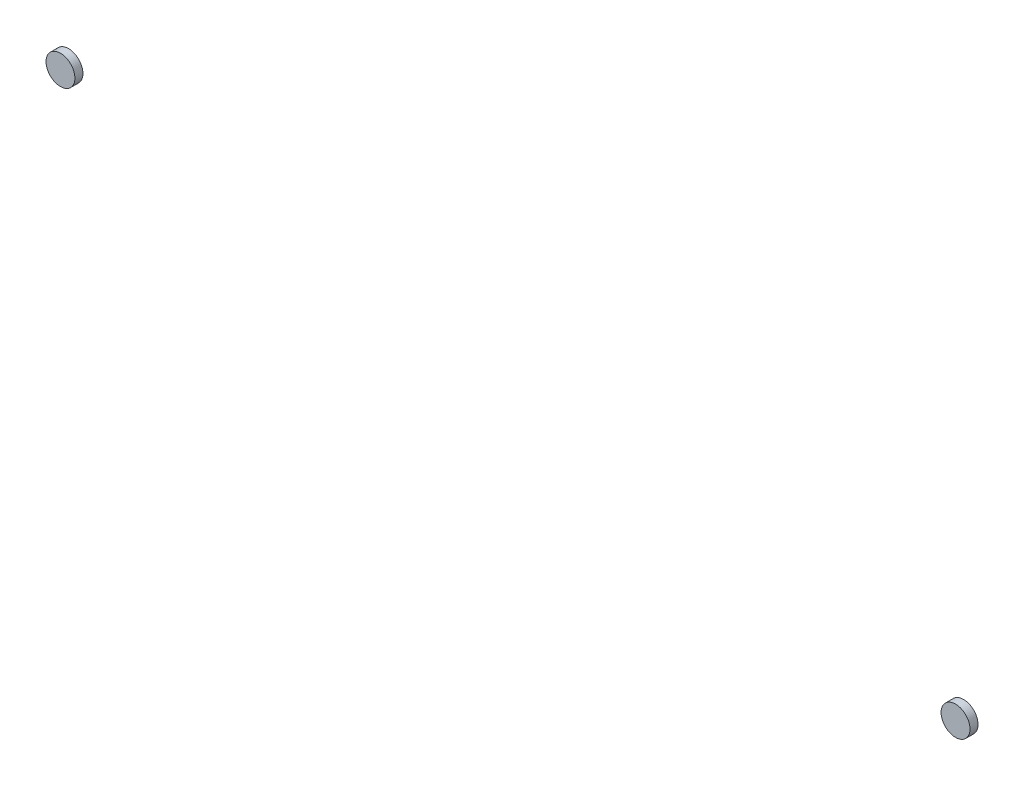
ISO-10303-21;
HEADER;
FILE_DESCRIPTION(('STEP AP214'),'2;1');
FILE_NAME('part.step','',(''),(''),'','','');
FILE_SCHEMA(('AUTOMOTIVE_DESIGN { 1 0 10303 214 1 1 1 1 }'));
ENDSEC;
DATA;
#1=APPLICATION_CONTEXT('core data for automotive mechanical design processes');
#2=APPLICATION_PROTOCOL_DEFINITION('international standard','automotive_design',2000,#1);
#3=PRODUCT_CONTEXT('',#1,'mechanical');
#4=PRODUCT('Part','Part','',(#3));
#5=PRODUCT_RELATED_PRODUCT_CATEGORY('part','',(#4));
#6=PRODUCT_DEFINITION_FORMATION('','',#4);
#7=PRODUCT_DEFINITION_CONTEXT('part definition',#1,'design');
#8=PRODUCT_DEFINITION('design','',#6,#7);
#9=PRODUCT_DEFINITION_SHAPE('','',#8);
#10=(LENGTH_UNIT() NAMED_UNIT(*) SI_UNIT(.MILLI.,.METRE.));
#11=(NAMED_UNIT(*) PLANE_ANGLE_UNIT() SI_UNIT($,.RADIAN.));
#12=(NAMED_UNIT(*) SI_UNIT($,.STERADIAN.) SOLID_ANGLE_UNIT());
#13=UNCERTAINTY_MEASURE_WITH_UNIT(LENGTH_MEASURE(1.E-05),#10,'distance_accuracy_value','');
#14=(GEOMETRIC_REPRESENTATION_CONTEXT(3) GLOBAL_UNCERTAINTY_ASSIGNED_CONTEXT((#13)) GLOBAL_UNIT_ASSIGNED_CONTEXT((#10,
#11,#12)) REPRESENTATION_CONTEXT('',''));
#15=CARTESIAN_POINT('',(0.,0.,0.));
#16=DIRECTION('',(0.,0.,1.));
#17=DIRECTION('',(1.,0.,0.));
#18=AXIS2_PLACEMENT_3D('',#15,#16,#17);
#19=CARTESIAN_POINT('',(-23.3600024412425,10.930976910022,-0.253998963258981));
#20=DIRECTION('',(0.,-8.74227339409092E-08,1.));
#21=DIRECTION('',(1.,-8.74227765734792E-08,0.));
#22=AXIS2_PLACEMENT_3D('',#19,#20,#21);
#23=PLANE('',#22);
#24=CARTESIAN_POINT('',(-22.9028024412425,10.9309768700523,-0.253998963258985));
#25=DIRECTION('',(0.,8.74227339409092E-08,-1.));
#26=DIRECTION('',(-1.,8.74227765734792E-08,0.));
#27=AXIS2_PLACEMENT_3D('',#24,#25,#26);
#28=CIRCLE('',#27,0.4572);
#29=CARTESIAN_POINT('',(-23.3600024412425,10.930976910022,-0.253998963258982));
#30=VERTEX_POINT('',#29);
#31=EDGE_CURVE('P0_E10',#30,#30,#28,.T.);
#32=ORIENTED_EDGE('',*,*,#31,.T.);
#33=EDGE_LOOP('',(#32));
#34=FACE_BOUND('',#33,.T.);
#35=ADVANCED_FACE('P0_F15',(#34),#23,.F.);
#36=CARTESIAN_POINT('',(-23.3600024412425,10.9309768878166,1.0367410172539E-06));
#37=DIRECTION('',(0.,-8.74227339409092E-08,1.));
#38=DIRECTION('',(1.,-8.74227765734792E-08,0.));
#39=AXIS2_PLACEMENT_3D('',#36,#37,#38);
#40=PLANE('',#39);
#41=CARTESIAN_POINT('',(-22.9028024412425,10.9309768478469,1.03674101378445E-06));
#42=DIRECTION('',(0.,8.74227339409092E-08,-1.));
#43=DIRECTION('',(-1.,8.74227765734792E-08,0.));
#44=AXIS2_PLACEMENT_3D('',#41,#42,#43);
#45=CIRCLE('',#44,0.4572);
#46=CARTESIAN_POINT('',(-23.3600024412425,10.9309768878166,1.03674101727871E-06));
#47=VERTEX_POINT('',#46);
#48=EDGE_CURVE('P0_E22',#47,#47,#45,.T.);
#49=ORIENTED_EDGE('',*,*,#48,.F.);
#50=EDGE_LOOP('',(#49));
#51=FACE_BOUND('',#50,.T.);
#52=ADVANCED_FACE('P0_F35',(#51),#40,.T.);
#53=CARTESIAN_POINT('',(-22.9028024412425,10.9309768478469,1.03674101378445E-06));
#54=DIRECTION('',(0.,-8.74227339409092E-08,1.));
#55=DIRECTION('',(-1.,8.74227765734792E-08,0.));
#56=AXIS2_PLACEMENT_3D('',#53,#54,#55);
#57=CYLINDRICAL_SURFACE('',#56,0.4572);
#58=ORIENTED_EDGE('',*,*,#31,.F.);
#59=EDGE_LOOP('',(#58));
#60=FACE_BOUND('',#59,.T.);
#61=ORIENTED_EDGE('',*,*,#48,.T.);
#62=EDGE_LOOP('',(#61));
#63=FACE_BOUND('',#62,.T.);
#64=ADVANCED_FACE('P0_F33',(#60,#63),#57,.T.);
#65=CLOSED_SHELL('',(#35,#52,#64));
#66=MANIFOLD_SOLID_BREP('P0_B1',#65);
#67=CARTESIAN_POINT('',(5.42220214183975,7.71317381829259,-0.253998923289316));
#68=DIRECTION('',(0.,-8.74227339409095E-08,1.));
#69=DIRECTION('',(-1.19248806384999E-08,-1.,-8.74227339409095E-08));
#70=AXIS2_PLACEMENT_3D('',#67,#68,#69);
#71=PLANE('',#70);
#72=CARTESIAN_POINT('',(5.42220213638769,7.2559738182926,-0.253998963258991));
#73=DIRECTION('',(0.,8.74227339409095E-08,-1.));
#74=DIRECTION('',(1.19248806384999E-08,1.,8.74227339409095E-08));
#75=AXIS2_PLACEMENT_3D('',#72,#73,#74);
#76=CIRCLE('',#75,0.4572);
#77=CARTESIAN_POINT('',(5.42220214183974,7.7131738182926,-0.253998923289317));
#78=VERTEX_POINT('',#77);
#79=EDGE_CURVE('P1_E10',#78,#78,#76,.T.);
#80=ORIENTED_EDGE('',*,*,#79,.T.);
#81=EDGE_LOOP('',(#80));
#82=FACE_BOUND('',#81,.T.);
#83=ADVANCED_FACE('P1_F15',(#82),#71,.F.);
#84=CARTESIAN_POINT('',(5.42220214183975,7.71317379608721,1.07671068285201E-06));
#85=DIRECTION('',(0.,-8.74227339409095E-08,1.));
#86=DIRECTION('',(-1.19248806384999E-08,-1.,-8.74227339409095E-08));
#87=AXIS2_PLACEMENT_3D('',#84,#85,#86);
#88=PLANE('',#87);
#89=CARTESIAN_POINT('',(5.42220213638769,7.25597379608722,1.03674100901396E-06));
#90=DIRECTION('',(0.,8.74227339409095E-08,-1.));
#91=DIRECTION('',(1.19248806384999E-08,1.,8.74227339409095E-08));
#92=AXIS2_PLACEMENT_3D('',#89,#90,#91);
#93=CIRCLE('',#92,0.4572);
#94=CARTESIAN_POINT('',(5.42220214183974,7.71317379608722,1.07671068297175E-06));
#95=VERTEX_POINT('',#94);
#96=EDGE_CURVE('P1_E22',#95,#95,#93,.T.);
#97=ORIENTED_EDGE('',*,*,#96,.F.);
#98=EDGE_LOOP('',(#97));
#99=FACE_BOUND('',#98,.T.);
#100=ADVANCED_FACE('P1_F35',(#99),#88,.T.);
#101=CARTESIAN_POINT('',(5.42220213638769,7.25597379608722,1.03674100901396E-06));
#102=DIRECTION('',(0.,-8.74227339409095E-08,1.));
#103=DIRECTION('',(1.19248806384999E-08,1.,8.74227339409095E-08));
#104=AXIS2_PLACEMENT_3D('',#101,#102,#103);
#105=CYLINDRICAL_SURFACE('',#104,0.4572);
#106=ORIENTED_EDGE('',*,*,#79,.F.);
#107=EDGE_LOOP('',(#106));
#108=FACE_BOUND('',#107,.T.);
#109=ORIENTED_EDGE('',*,*,#96,.T.);
#110=EDGE_LOOP('',(#109));
#111=FACE_BOUND('',#110,.T.);
#112=ADVANCED_FACE('P1_F33',(#108,#111),#105,.T.);
#113=CLOSED_SHELL('',(#83,#100,#112));
#114=MANIFOLD_SOLID_BREP('P1_B1',#113);
#115=ADVANCED_BREP_SHAPE_REPRESENTATION('',(#18,#66,#114),#14);
#116=SHAPE_DEFINITION_REPRESENTATION(#9,#115);
ENDSEC;
END-ISO-10303-21;
